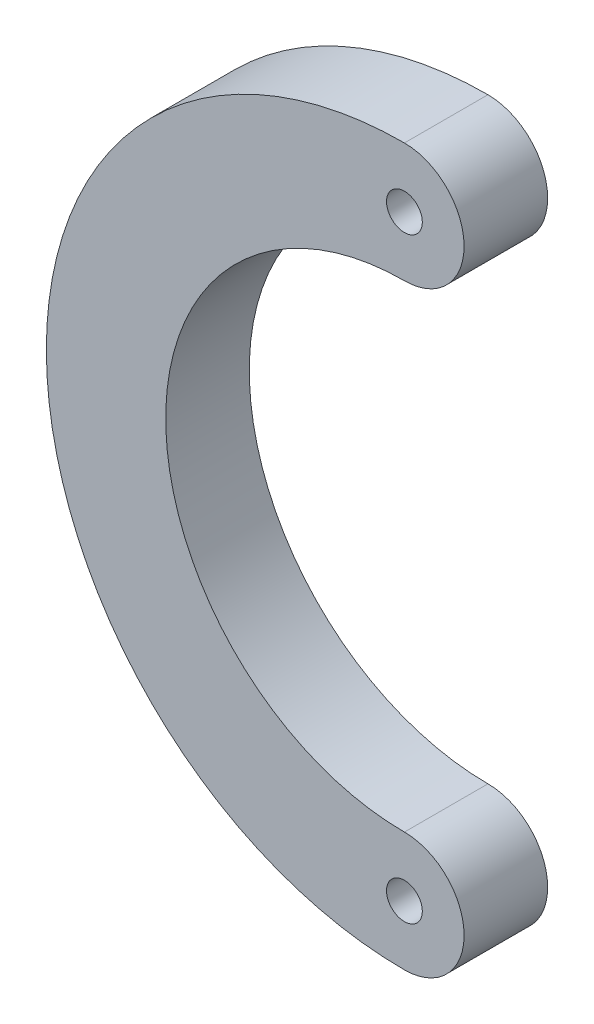
ISO-10303-21;
HEADER;
FILE_DESCRIPTION(('STEP AP214'),'2;1');
FILE_NAME('part.step','',(''),(''),'','','');
FILE_SCHEMA(('AUTOMOTIVE_DESIGN { 1 0 10303 214 1 1 1 1 }'));
ENDSEC;
DATA;
#1=APPLICATION_CONTEXT('core data for automotive mechanical design processes');
#2=APPLICATION_PROTOCOL_DEFINITION('international standard','automotive_design',2000,#1);
#3=PRODUCT_CONTEXT('',#1,'mechanical');
#4=PRODUCT('Part','Part','',(#3));
#5=PRODUCT_RELATED_PRODUCT_CATEGORY('part','',(#4));
#6=PRODUCT_DEFINITION_FORMATION('','',#4);
#7=PRODUCT_DEFINITION_CONTEXT('part definition',#1,'design');
#8=PRODUCT_DEFINITION('design','',#6,#7);
#9=PRODUCT_DEFINITION_SHAPE('','',#8);
#10=(LENGTH_UNIT() NAMED_UNIT(*) SI_UNIT(.MILLI.,.METRE.));
#11=(NAMED_UNIT(*) PLANE_ANGLE_UNIT() SI_UNIT($,.RADIAN.));
#12=(NAMED_UNIT(*) SI_UNIT($,.STERADIAN.) SOLID_ANGLE_UNIT());
#13=UNCERTAINTY_MEASURE_WITH_UNIT(LENGTH_MEASURE(1.E-05),#10,'distance_accuracy_value','');
#14=(GEOMETRIC_REPRESENTATION_CONTEXT(3) GLOBAL_UNCERTAINTY_ASSIGNED_CONTEXT((#13)) GLOBAL_UNIT_ASSIGNED_CONTEXT((#10,
#11,#12)) REPRESENTATION_CONTEXT('',''));
#15=CARTESIAN_POINT('',(0.,0.,0.));
#16=DIRECTION('',(0.,0.,1.));
#17=DIRECTION('',(1.,0.,0.));
#18=AXIS2_PLACEMENT_3D('',#15,#16,#17);
#19=CARTESIAN_POINT('',(0.,-25.,7.));
#20=DIRECTION('',(0.,0.,-1.));
#21=DIRECTION('',(-1.,0.,0.));
#22=AXIS2_PLACEMENT_3D('',#19,#20,#21);
#23=CYLINDRICAL_SURFACE('',#22,5.);
#24=CARTESIAN_POINT('',(0.,-25.,0.));
#25=DIRECTION('',(0.,0.,1.));
#26=DIRECTION('',(1.,0.,0.));
#27=AXIS2_PLACEMENT_3D('',#24,#25,#26);
#28=CIRCLE('',#27,5.);
#29=CARTESIAN_POINT('',(0.,-30.,0.));
#30=VERTEX_POINT('',#29);
#31=CARTESIAN_POINT('',(0.,-20.,0.));
#32=VERTEX_POINT('',#31);
#33=EDGE_CURVE('E135',#30,#32,#28,.T.);
#34=ORIENTED_EDGE('',*,*,#33,.T.);
#35=DIRECTION('',(0.,0.,-1.));
#36=VECTOR('',#35,1.);
#37=CARTESIAN_POINT('',(0.,-20.,7.));
#38=LINE('',#37,#36);
#39=CARTESIAN_POINT('',(0.,-20.,7.));
#40=VERTEX_POINT('',#39);
#41=EDGE_CURVE('E12',#40,#32,#38,.T.);
#42=ORIENTED_EDGE('',*,*,#41,.F.);
#43=CARTESIAN_POINT('',(0.,-25.,7.));
#44=DIRECTION('',(0.,0.,1.));
#45=DIRECTION('',(1.,0.,0.));
#46=AXIS2_PLACEMENT_3D('',#43,#44,#45);
#47=CIRCLE('',#46,5.);
#48=CARTESIAN_POINT('',(0.,-30.,7.));
#49=VERTEX_POINT('',#48);
#50=EDGE_CURVE('E98',#49,#40,#47,.T.);
#51=ORIENTED_EDGE('',*,*,#50,.F.);
#52=DIRECTION('',(0.,0.,-1.));
#53=VECTOR('',#52,1.);
#54=CARTESIAN_POINT('',(0.,-30.,7.));
#55=LINE('',#54,#53);
#56=EDGE_CURVE('E110',#49,#30,#55,.T.);
#57=ORIENTED_EDGE('',*,*,#56,.T.);
#58=EDGE_LOOP('',(#34,#42,#51,#57));
#59=FACE_BOUND('',#58,.T.);
#60=ADVANCED_FACE('F46',(#59),#23,.T.);
#61=CARTESIAN_POINT('',(0.,0.,7.));
#62=DIRECTION('',(0.,0.,-1.));
#63=DIRECTION('',(-1.,0.,0.));
#64=AXIS2_PLACEMENT_3D('',#61,#62,#63);
#65=CYLINDRICAL_SURFACE('',#64,20.);
#66=CARTESIAN_POINT('',(0.,0.,0.));
#67=DIRECTION('',(0.,0.,-1.));
#68=DIRECTION('',(1.,0.,0.));
#69=AXIS2_PLACEMENT_3D('',#66,#67,#68);
#70=CIRCLE('',#69,20.);
#71=CARTESIAN_POINT('',(0.,20.,0.));
#72=VERTEX_POINT('',#71);
#73=EDGE_CURVE('E103',#32,#72,#70,.T.);
#74=ORIENTED_EDGE('',*,*,#73,.T.);
#75=DIRECTION('',(0.,0.,-1.));
#76=VECTOR('',#75,1.);
#77=CARTESIAN_POINT('',(0.,20.,7.));
#78=LINE('',#77,#76);
#79=CARTESIAN_POINT('',(0.,20.,7.));
#80=VERTEX_POINT('',#79);
#81=EDGE_CURVE('E55',#80,#72,#78,.T.);
#82=ORIENTED_EDGE('',*,*,#81,.F.);
#83=CARTESIAN_POINT('',(0.,0.,7.));
#84=DIRECTION('',(0.,0.,-1.));
#85=DIRECTION('',(1.,0.,0.));
#86=AXIS2_PLACEMENT_3D('',#83,#84,#85);
#87=CIRCLE('',#86,20.);
#88=EDGE_CURVE('E93',#40,#80,#87,.T.);
#89=ORIENTED_EDGE('',*,*,#88,.F.);
#90=ORIENTED_EDGE('',*,*,#41,.T.);
#91=EDGE_LOOP('',(#74,#82,#89,#90));
#92=FACE_BOUND('',#91,.T.);
#93=ADVANCED_FACE('F102',(#92),#65,.F.);
#94=CARTESIAN_POINT('',(0.,25.,7.));
#95=DIRECTION('',(0.,0.,-1.));
#96=DIRECTION('',(-1.,0.,0.));
#97=AXIS2_PLACEMENT_3D('',#94,#95,#96);
#98=CYLINDRICAL_SURFACE('',#97,5.);
#99=CARTESIAN_POINT('',(0.,25.,0.));
#100=DIRECTION('',(0.,0.,1.));
#101=DIRECTION('',(1.,0.,0.));
#102=AXIS2_PLACEMENT_3D('',#99,#100,#101);
#103=CIRCLE('',#102,5.);
#104=CARTESIAN_POINT('',(0.,30.,0.));
#105=VERTEX_POINT('',#104);
#106=EDGE_CURVE('E80',#72,#105,#103,.T.);
#107=ORIENTED_EDGE('',*,*,#106,.T.);
#108=DIRECTION('',(0.,0.,-1.));
#109=VECTOR('',#108,1.);
#110=CARTESIAN_POINT('',(0.,30.,7.));
#111=LINE('',#110,#109);
#112=CARTESIAN_POINT('',(0.,30.,7.));
#113=VERTEX_POINT('',#112);
#114=EDGE_CURVE('E105',#113,#105,#111,.T.);
#115=ORIENTED_EDGE('',*,*,#114,.F.);
#116=CARTESIAN_POINT('',(0.,25.,7.));
#117=DIRECTION('',(0.,0.,1.));
#118=DIRECTION('',(1.,0.,0.));
#119=AXIS2_PLACEMENT_3D('',#116,#117,#118);
#120=CIRCLE('',#119,5.);
#121=EDGE_CURVE('E96',#80,#113,#120,.T.);
#122=ORIENTED_EDGE('',*,*,#121,.F.);
#123=ORIENTED_EDGE('',*,*,#81,.T.);
#124=EDGE_LOOP('',(#107,#115,#122,#123));
#125=FACE_BOUND('',#124,.T.);
#126=ADVANCED_FACE('F106',(#125),#98,.T.);
#127=CARTESIAN_POINT('',(0.,0.,7.));
#128=DIRECTION('',(0.,0.,-1.));
#129=DIRECTION('',(-1.,0.,0.));
#130=AXIS2_PLACEMENT_3D('',#127,#128,#129);
#131=CYLINDRICAL_SURFACE('',#130,30.);
#132=CARTESIAN_POINT('',(0.,0.,0.));
#133=DIRECTION('',(0.,0.,1.));
#134=DIRECTION('',(1.,0.,0.));
#135=AXIS2_PLACEMENT_3D('',#132,#133,#134);
#136=CIRCLE('',#135,30.);
#137=EDGE_CURVE('E86',#105,#30,#136,.T.);
#138=ORIENTED_EDGE('',*,*,#137,.T.);
#139=ORIENTED_EDGE('',*,*,#56,.F.);
#140=CARTESIAN_POINT('',(0.,0.,7.));
#141=DIRECTION('',(0.,0.,1.));
#142=DIRECTION('',(1.,0.,0.));
#143=AXIS2_PLACEMENT_3D('',#140,#141,#142);
#144=CIRCLE('',#143,30.);
#145=EDGE_CURVE('E63',#113,#49,#144,.T.);
#146=ORIENTED_EDGE('',*,*,#145,.F.);
#147=ORIENTED_EDGE('',*,*,#114,.T.);
#148=EDGE_LOOP('',(#138,#139,#146,#147));
#149=FACE_BOUND('',#148,.T.);
#150=ADVANCED_FACE('F168',(#149),#131,.T.);
#151=CARTESIAN_POINT('',(0.,-12.5,7.));
#152=DIRECTION('',(0.,0.,1.));
#153=DIRECTION('',(1.,0.,0.));
#154=AXIS2_PLACEMENT_3D('',#151,#152,#153);
#155=PLANE('',#154);
#156=CARTESIAN_POINT('',(0.,25.,7.));
#157=DIRECTION('',(0.,0.,1.));
#158=DIRECTION('',(1.,0.,0.));
#159=AXIS2_PLACEMENT_3D('',#156,#157,#158);
#160=CIRCLE('',#159,1.5);
#161=CARTESIAN_POINT('',(1.5,25.,7.));
#162=VERTEX_POINT('',#161);
#163=EDGE_CURVE('E157',#162,#162,#160,.T.);
#164=ORIENTED_EDGE('',*,*,#163,.F.);
#165=EDGE_LOOP('',(#164));
#166=FACE_BOUND('',#165,.T.);
#167=CARTESIAN_POINT('',(0.,-25.,7.));
#168=DIRECTION('',(0.,0.,1.));
#169=DIRECTION('',(1.,0.,0.));
#170=AXIS2_PLACEMENT_3D('',#167,#168,#169);
#171=CIRCLE('',#170,1.5);
#172=CARTESIAN_POINT('',(1.5,-25.,7.));
#173=VERTEX_POINT('',#172);
#174=EDGE_CURVE('E144',#173,#173,#171,.T.);
#175=ORIENTED_EDGE('',*,*,#174,.F.);
#176=EDGE_LOOP('',(#175));
#177=FACE_BOUND('',#176,.T.);
#178=ORIENTED_EDGE('',*,*,#50,.T.);
#179=ORIENTED_EDGE('',*,*,#88,.T.);
#180=ORIENTED_EDGE('',*,*,#121,.T.);
#181=ORIENTED_EDGE('',*,*,#145,.T.);
#182=EDGE_LOOP('',(#178,#179,#180,#181));
#183=FACE_BOUND('',#182,.T.);
#184=ADVANCED_FACE('F94',(#166,#177,#183),#155,.T.);
#185=CARTESIAN_POINT('',(0.,-12.5,0.));
#186=DIRECTION('',(0.,0.,1.));
#187=DIRECTION('',(1.,0.,0.));
#188=AXIS2_PLACEMENT_3D('',#185,#186,#187);
#189=PLANE('',#188);
#190=CARTESIAN_POINT('',(0.,25.,0.));
#191=DIRECTION('',(0.,0.,1.));
#192=DIRECTION('',(1.,0.,0.));
#193=AXIS2_PLACEMENT_3D('',#190,#191,#192);
#194=CIRCLE('',#193,1.5);
#195=CARTESIAN_POINT('',(1.5,25.,0.));
#196=VERTEX_POINT('',#195);
#197=EDGE_CURVE('E150',#196,#196,#194,.T.);
#198=ORIENTED_EDGE('',*,*,#197,.T.);
#199=EDGE_LOOP('',(#198));
#200=FACE_BOUND('',#199,.T.);
#201=CARTESIAN_POINT('',(0.,-25.,0.));
#202=DIRECTION('',(0.,0.,1.));
#203=DIRECTION('',(1.,0.,0.));
#204=AXIS2_PLACEMENT_3D('',#201,#202,#203);
#205=CIRCLE('',#204,1.5);
#206=CARTESIAN_POINT('',(1.5,-25.,0.));
#207=VERTEX_POINT('',#206);
#208=EDGE_CURVE('E139',#207,#207,#205,.T.);
#209=ORIENTED_EDGE('',*,*,#208,.T.);
#210=EDGE_LOOP('',(#209));
#211=FACE_BOUND('',#210,.T.);
#212=ORIENTED_EDGE('',*,*,#33,.F.);
#213=ORIENTED_EDGE('',*,*,#137,.F.);
#214=ORIENTED_EDGE('',*,*,#106,.F.);
#215=ORIENTED_EDGE('',*,*,#73,.F.);
#216=EDGE_LOOP('',(#212,#213,#214,#215));
#217=FACE_BOUND('',#216,.T.);
#218=ADVANCED_FACE('F167',(#200,#211,#217),#189,.F.);
#219=CARTESIAN_POINT('',(0.,-25.,7.));
#220=DIRECTION('',(0.,0.,1.));
#221=DIRECTION('',(1.,0.,0.));
#222=AXIS2_PLACEMENT_3D('',#219,#220,#221);
#223=CYLINDRICAL_SURFACE('',#222,1.5);
#224=ORIENTED_EDGE('',*,*,#208,.F.);
#225=EDGE_LOOP('',(#224));
#226=FACE_BOUND('',#225,.T.);
#227=ORIENTED_EDGE('',*,*,#174,.T.);
#228=EDGE_LOOP('',(#227));
#229=FACE_BOUND('',#228,.T.);
#230=ADVANCED_FACE('F172',(#226,#229),#223,.F.);
#231=CARTESIAN_POINT('',(0.,25.,7.));
#232=DIRECTION('',(0.,0.,1.));
#233=DIRECTION('',(1.,0.,0.));
#234=AXIS2_PLACEMENT_3D('',#231,#232,#233);
#235=CYLINDRICAL_SURFACE('',#234,1.5);
#236=ORIENTED_EDGE('',*,*,#197,.F.);
#237=EDGE_LOOP('',(#236));
#238=FACE_BOUND('',#237,.T.);
#239=ORIENTED_EDGE('',*,*,#163,.T.);
#240=EDGE_LOOP('',(#239));
#241=FACE_BOUND('',#240,.T.);
#242=ADVANCED_FACE('F163',(#238,#241),#235,.F.);
#243=CLOSED_SHELL('',(#60,#93,#126,#150,#184,#218,#230,#242));
#244=MANIFOLD_SOLID_BREP('B2',#243);
#245=ADVANCED_BREP_SHAPE_REPRESENTATION('',(#18,#244),#14);
#246=SHAPE_DEFINITION_REPRESENTATION(#9,#245);
ENDSEC;
END-ISO-10303-21;
